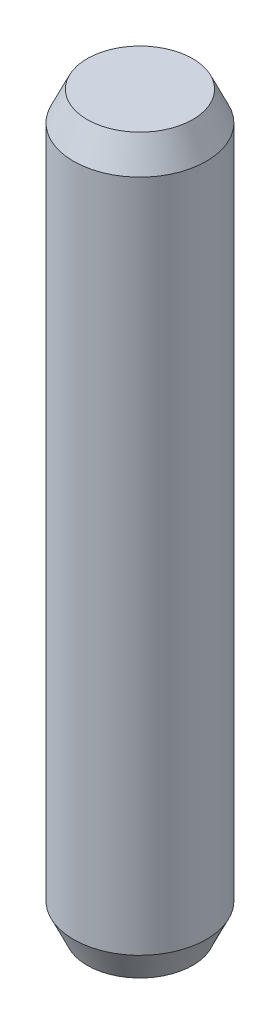
ISO-10303-21;
HEADER;
FILE_DESCRIPTION(('STEP AP214'),'2;1');
FILE_NAME('part.step','',(''),(''),'','','');
FILE_SCHEMA(('AUTOMOTIVE_DESIGN { 1 0 10303 214 1 1 1 1 }'));
ENDSEC;
DATA;
#1=APPLICATION_CONTEXT('core data for automotive mechanical design processes');
#2=APPLICATION_PROTOCOL_DEFINITION('international standard','automotive_design',2000,#1);
#3=PRODUCT_CONTEXT('',#1,'mechanical');
#4=PRODUCT('Part','Part','',(#3));
#5=PRODUCT_RELATED_PRODUCT_CATEGORY('part','',(#4));
#6=PRODUCT_DEFINITION_FORMATION('','',#4);
#7=PRODUCT_DEFINITION_CONTEXT('part definition',#1,'design');
#8=PRODUCT_DEFINITION('design','',#6,#7);
#9=PRODUCT_DEFINITION_SHAPE('','',#8);
#10=(LENGTH_UNIT() NAMED_UNIT(*) SI_UNIT(.MILLI.,.METRE.));
#11=(NAMED_UNIT(*) PLANE_ANGLE_UNIT() SI_UNIT($,.RADIAN.));
#12=(NAMED_UNIT(*) SI_UNIT($,.STERADIAN.) SOLID_ANGLE_UNIT());
#13=UNCERTAINTY_MEASURE_WITH_UNIT(LENGTH_MEASURE(1.E-05),#10,'distance_accuracy_value','');
#14=(GEOMETRIC_REPRESENTATION_CONTEXT(3) GLOBAL_UNCERTAINTY_ASSIGNED_CONTEXT((#13)) GLOBAL_UNIT_ASSIGNED_CONTEXT((#10,
#11,#12)) REPRESENTATION_CONTEXT('',''));
#15=CARTESIAN_POINT('',(0.,0.,0.));
#16=DIRECTION('',(0.,0.,1.));
#17=DIRECTION('',(1.,0.,0.));
#18=AXIS2_PLACEMENT_3D('',#15,#16,#17);
#19=CARTESIAN_POINT('',(0.,35.,0.));
#20=DIRECTION('',(0.,-1.,0.));
#21=DIRECTION('',(0.,0.,-1.));
#22=AXIS2_PLACEMENT_3D('',#19,#20,#21);
#23=CYLINDRICAL_SURFACE('',#22,3.175);
#24=CARTESIAN_POINT('',(0.,1.40000000000001,0.));
#25=DIRECTION('',(0.,1.,0.));
#26=DIRECTION('',(0.,0.,1.));
#27=AXIS2_PLACEMENT_3D('',#24,#25,#26);
#28=CIRCLE('',#27,3.175);
#29=CARTESIAN_POINT('',(0.,1.40000000000001,3.175));
#30=VERTEX_POINT('',#29);
#31=EDGE_CURVE('E42',#30,#30,#28,.T.);
#32=ORIENTED_EDGE('',*,*,#31,.T.);
#33=EDGE_LOOP('',(#32));
#34=FACE_BOUND('',#33,.T.);
#35=CARTESIAN_POINT('',(0.,33.6,0.));
#36=DIRECTION('',(0.,1.,0.));
#37=DIRECTION('',(0.,0.,1.));
#38=AXIS2_PLACEMENT_3D('',#35,#36,#37);
#39=CIRCLE('',#38,3.175);
#40=CARTESIAN_POINT('',(0.,33.6,3.175));
#41=VERTEX_POINT('',#40);
#42=EDGE_CURVE('E46',#41,#41,#39,.F.);
#43=ORIENTED_EDGE('',*,*,#42,.T.);
#44=EDGE_LOOP('',(#43));
#45=FACE_BOUND('',#44,.T.);
#46=ADVANCED_FACE('F31',(#34,#45),#23,.T.);
#47=CARTESIAN_POINT('',(0.,35.,0.));
#48=DIRECTION('',(0.,1.,0.));
#49=DIRECTION('',(0.,0.,1.));
#50=AXIS2_PLACEMENT_3D('',#47,#48,#49);
#51=PLANE('',#50);
#52=CARTESIAN_POINT('',(0.,35.,0.));
#53=DIRECTION('',(0.,1.,0.));
#54=DIRECTION('',(0.,0.,1.));
#55=AXIS2_PLACEMENT_3D('',#52,#53,#54);
#56=CIRCLE('',#55,2.522169278583);
#57=CARTESIAN_POINT('',(0.,35.,2.522169278583));
#58=VERTEX_POINT('',#57);
#59=EDGE_CURVE('E10',#58,#58,#56,.T.);
#60=ORIENTED_EDGE('',*,*,#59,.T.);
#61=EDGE_LOOP('',(#60));
#62=FACE_BOUND('',#61,.T.);
#63=ADVANCED_FACE('F62',(#62),#51,.T.);
#64=CARTESIAN_POINT('',(0.,0.,0.));
#65=DIRECTION('',(0.,1.,0.));
#66=DIRECTION('',(0.,0.,1.));
#67=AXIS2_PLACEMENT_3D('',#64,#65,#66);
#68=PLANE('',#67);
#69=CARTESIAN_POINT('',(0.,0.,0.));
#70=DIRECTION('',(0.,1.,0.));
#71=DIRECTION('',(0.,0.,1.));
#72=AXIS2_PLACEMENT_3D('',#69,#70,#71);
#73=CIRCLE('',#72,2.522169278583);
#74=CARTESIAN_POINT('',(0.,0.,2.522169278583));
#75=VERTEX_POINT('',#74);
#76=EDGE_CURVE('E38',#75,#75,#73,.F.);
#77=ORIENTED_EDGE('',*,*,#76,.T.);
#78=EDGE_LOOP('',(#77));
#79=FACE_BOUND('',#78,.T.);
#80=ADVANCED_FACE('F59',(#79),#68,.F.);
#81=CARTESIAN_POINT('',(0.,1.40000000000001,0.));
#82=DIRECTION('',(0.,1.,0.));
#83=DIRECTION('',(0.,0.,1.));
#84=AXIS2_PLACEMENT_3D('',#81,#82,#83);
#85=CONICAL_SURFACE('',#84,3.175,0.436332312998579);
#86=ORIENTED_EDGE('',*,*,#76,.F.);
#87=EDGE_LOOP('',(#86));
#88=FACE_BOUND('',#87,.T.);
#89=ORIENTED_EDGE('',*,*,#31,.F.);
#90=EDGE_LOOP('',(#89));
#91=FACE_BOUND('',#90,.T.);
#92=ADVANCED_FACE('F55',(#88,#91),#85,.T.);
#93=CARTESIAN_POINT('',(0.,35.,0.));
#94=DIRECTION('',(0.,-1.,0.));
#95=DIRECTION('',(0.,0.,-1.));
#96=AXIS2_PLACEMENT_3D('',#93,#94,#95);
#97=CONICAL_SURFACE('',#96,2.522169278583,0.436332312998579);
#98=ORIENTED_EDGE('',*,*,#42,.F.);
#99=EDGE_LOOP('',(#98));
#100=FACE_BOUND('',#99,.T.);
#101=ORIENTED_EDGE('',*,*,#59,.F.);
#102=EDGE_LOOP('',(#101));
#103=FACE_BOUND('',#102,.T.);
#104=ADVANCED_FACE('F33',(#100,#103),#97,.T.);
#105=CLOSED_SHELL('',(#46,#63,#80,#92,#104));
#106=MANIFOLD_SOLID_BREP('B2',#105);
#107=ADVANCED_BREP_SHAPE_REPRESENTATION('',(#18,#106),#14);
#108=SHAPE_DEFINITION_REPRESENTATION(#9,#107);
ENDSEC;
END-ISO-10303-21;
